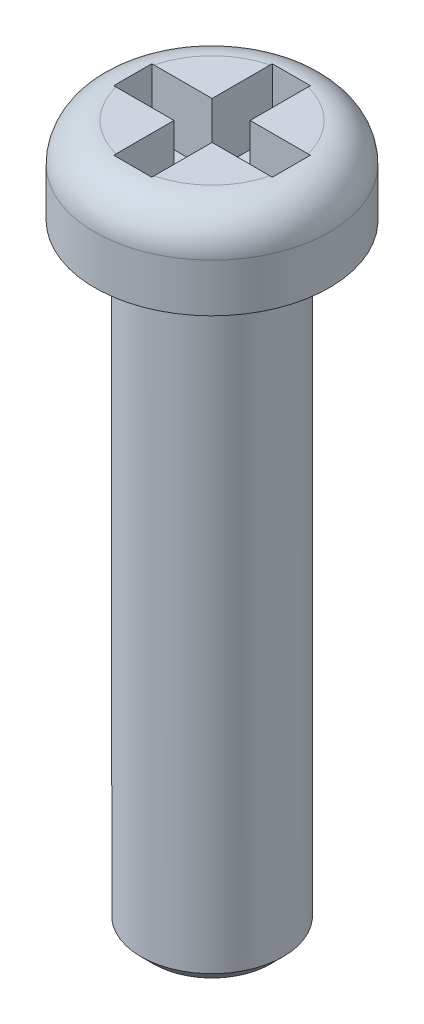
ISO-10303-21;
HEADER;
FILE_DESCRIPTION(('STEP AP214'),'2;1');
FILE_NAME('part.step','',(''),(''),'','','');
FILE_SCHEMA(('AUTOMOTIVE_DESIGN { 1 0 10303 214 1 1 1 1 }'));
ENDSEC;
DATA;
#1=APPLICATION_CONTEXT('core data for automotive mechanical design processes');
#2=APPLICATION_PROTOCOL_DEFINITION('international standard','automotive_design',2000,#1);
#3=PRODUCT_CONTEXT('',#1,'mechanical');
#4=PRODUCT('Part','Part','',(#3));
#5=PRODUCT_RELATED_PRODUCT_CATEGORY('part','',(#4));
#6=PRODUCT_DEFINITION_FORMATION('','',#4);
#7=PRODUCT_DEFINITION_CONTEXT('part definition',#1,'design');
#8=PRODUCT_DEFINITION('design','',#6,#7);
#9=PRODUCT_DEFINITION_SHAPE('','',#8);
#10=(LENGTH_UNIT() NAMED_UNIT(*) SI_UNIT(.MILLI.,.METRE.));
#11=(NAMED_UNIT(*) PLANE_ANGLE_UNIT() SI_UNIT($,.RADIAN.));
#12=(NAMED_UNIT(*) SI_UNIT($,.STERADIAN.) SOLID_ANGLE_UNIT());
#13=UNCERTAINTY_MEASURE_WITH_UNIT(LENGTH_MEASURE(1.E-05),#10,'distance_accuracy_value','');
#14=(GEOMETRIC_REPRESENTATION_CONTEXT(3) GLOBAL_UNCERTAINTY_ASSIGNED_CONTEXT((#13)) GLOBAL_UNIT_ASSIGNED_CONTEXT((#10,
#11,#12)) REPRESENTATION_CONTEXT('',''));
#15=CARTESIAN_POINT('',(0.,0.,0.));
#16=DIRECTION('',(0.,0.,1.));
#17=DIRECTION('',(1.,0.,0.));
#18=AXIS2_PLACEMENT_3D('',#15,#16,#17);
#19=CARTESIAN_POINT('',(-0.380999999999951,0.457199999999935,0.381000000000062));
#20=DIRECTION('',(0.,-1.,0.));
#21=DIRECTION('',(0.,0.,-1.));
#22=AXIS2_PLACEMENT_3D('',#19,#20,#21);
#23=PLANE('',#22);
#24=DIRECTION('',(1.,0.,0.));
#25=VECTOR('',#24,1.);
#26=CARTESIAN_POINT('',(-0.381000000000006,0.457199999999956,1.58750000000001));
#27=LINE('',#26,#25);
#28=CARTESIAN_POINT('',(-0.381000000000006,0.457199999999942,1.58750000000001));
#29=VERTEX_POINT('',#28);
#30=CARTESIAN_POINT('',(0.381000000000131,0.457199999999956,1.58750000000001));
#31=VERTEX_POINT('',#30);
#32=EDGE_CURVE('E320',#29,#31,#27,.T.);
#33=ORIENTED_EDGE('',*,*,#32,.T.);
#34=DIRECTION('',(0.,0.,1.));
#35=VECTOR('',#34,1.);
#36=CARTESIAN_POINT('',(0.381000000000131,0.457199999999956,1.58750000000004));
#37=LINE('',#36,#35);
#38=CARTESIAN_POINT('',(0.381000000000131,0.457199999999949,0.381000000000006));
#39=VERTEX_POINT('',#38);
#40=EDGE_CURVE('E448',#31,#39,#37,.F.);
#41=ORIENTED_EDGE('',*,*,#40,.T.);
#42=DIRECTION('',(1.,0.,0.));
#43=VECTOR('',#42,1.);
#44=CARTESIAN_POINT('',(0.380999999999992,0.457199999999935,0.381000000000006));
#45=LINE('',#44,#43);
#46=CARTESIAN_POINT('',(1.58750000000005,0.457199999999935,0.381000000000006));
#47=VERTEX_POINT('',#46);
#48=EDGE_CURVE('E455',#39,#47,#45,.T.);
#49=ORIENTED_EDGE('',*,*,#48,.T.);
#50=DIRECTION('',(0.,0.,1.));
#51=VECTOR('',#50,1.);
#52=CARTESIAN_POINT('',(1.58750000000005,0.457199999999935,0.381000000000055));
#53=LINE('',#52,#51);
#54=CARTESIAN_POINT('',(1.58750000000005,0.457199999999935,-0.380999999999976));
#55=VERTEX_POINT('',#54);
#56=EDGE_CURVE('E150',#47,#55,#53,.F.);
#57=ORIENTED_EDGE('',*,*,#56,.T.);
#58=DIRECTION('',(1.,0.,0.));
#59=VECTOR('',#58,1.);
#60=CARTESIAN_POINT('',(0.381000000000131,0.457199999999935,-0.381000000000027));
#61=LINE('',#60,#59);
#62=CARTESIAN_POINT('',(0.381000000000131,0.457199999999935,-0.381000000000026));
#63=VERTEX_POINT('',#62);
#64=EDGE_CURVE('E146',#55,#63,#61,.F.);
#65=ORIENTED_EDGE('',*,*,#64,.T.);
#66=DIRECTION('',(0.,0.,1.));
#67=VECTOR('',#66,1.);
#68=CARTESIAN_POINT('',(0.381000000000131,0.457199999999935,-0.381000000000027));
#69=LINE('',#68,#67);
#70=CARTESIAN_POINT('',(0.381000000000029,0.457199999999949,-1.58749999999998));
#71=VERTEX_POINT('',#70);
#72=EDGE_CURVE('E147',#63,#71,#69,.F.);
#73=ORIENTED_EDGE('',*,*,#72,.T.);
#74=DIRECTION('',(1.,0.,0.));
#75=VECTOR('',#74,1.);
#76=CARTESIAN_POINT('',(-0.380999999999951,0.457199999999956,-1.58749999999997));
#77=LINE('',#76,#75);
#78=CARTESIAN_POINT('',(-0.380999999999955,0.457199999999956,-1.58749999999997));
#79=VERTEX_POINT('',#78);
#80=EDGE_CURVE('E88',#71,#79,#77,.F.);
#81=ORIENTED_EDGE('',*,*,#80,.T.);
#82=DIRECTION('',(0.,0.,1.));
#83=VECTOR('',#82,1.);
#84=CARTESIAN_POINT('',(-0.380999999999965,0.457199999999956,-0.380999999999951));
#85=LINE('',#84,#83);
#86=CARTESIAN_POINT('',(-0.380999999999965,0.457199999999949,-0.380999999999965));
#87=VERTEX_POINT('',#86);
#88=EDGE_CURVE('E412',#79,#87,#85,.T.);
#89=ORIENTED_EDGE('',*,*,#88,.T.);
#90=DIRECTION('',(1.,0.,0.));
#91=VECTOR('',#90,1.);
#92=CARTESIAN_POINT('',(-1.58750000000001,0.457199999999935,-0.380999999999992));
#93=LINE('',#92,#91);
#94=CARTESIAN_POINT('',(-1.58749999999999,0.457199999999935,-0.380999999999992));
#95=VERTEX_POINT('',#94);
#96=EDGE_CURVE('E424',#87,#95,#93,.F.);
#97=ORIENTED_EDGE('',*,*,#96,.T.);
#98=DIRECTION('',(0.,0.,1.));
#99=VECTOR('',#98,1.);
#100=CARTESIAN_POINT('',(-1.58749999999995,0.457199999999935,0.381000000000058));
#101=LINE('',#100,#99);
#102=CARTESIAN_POINT('',(-1.58749999999995,0.457199999999935,0.381000000000058));
#103=VERTEX_POINT('',#102);
#104=EDGE_CURVE('E430',#95,#103,#101,.T.);
#105=ORIENTED_EDGE('',*,*,#104,.T.);
#106=DIRECTION('',(1.,0.,0.));
#107=VECTOR('',#106,1.);
#108=CARTESIAN_POINT('',(-1.58749999999995,0.457199999999935,0.381000000000058));
#109=LINE('',#108,#107);
#110=CARTESIAN_POINT('',(-0.380999999999969,0.457199999999935,0.381000000000058));
#111=VERTEX_POINT('',#110);
#112=EDGE_CURVE('E300',#103,#111,#109,.T.);
#113=ORIENTED_EDGE('',*,*,#112,.T.);
#114=DIRECTION('',(0.,0.,1.));
#115=VECTOR('',#114,1.);
#116=CARTESIAN_POINT('',(-0.381000000000006,0.457199999999935,1.58750000000001));
#117=LINE('',#116,#115);
#118=EDGE_CURVE('E315',#111,#29,#117,.T.);
#119=ORIENTED_EDGE('',*,*,#118,.T.);
#120=EDGE_LOOP('',(#33,#41,#49,#57,#65,#73,#81,#89,#97,#105,#113,#119));
#121=FACE_BOUND('',#120,.T.);
#122=ADVANCED_FACE('F16',(#121),#23,.F.);
#123=CARTESIAN_POINT('',(0.381000000000131,0.457199999999935,-0.381000000000027));
#124=DIRECTION('',(1.,0.,0.));
#125=DIRECTION('',(0.,1.,0.));
#126=AXIS2_PLACEMENT_3D('',#123,#124,#125);
#127=PLANE('',#126);
#128=DIRECTION('',(0.,1.,0.));
#129=VECTOR('',#128,1.);
#130=CARTESIAN_POINT('',(0.380999999999979,0.457199999999956,-1.58749999999997));
#131=LINE('',#130,#129);
#132=CARTESIAN_POINT('',(0.381000000000054,1.72586536617557,-1.58749999999998));
#133=VERTEX_POINT('',#132);
#134=EDGE_CURVE('E157',#133,#71,#131,.F.);
#135=ORIENTED_EDGE('',*,*,#134,.T.);
#136=ORIENTED_EDGE('',*,*,#72,.F.);
#137=DIRECTION('',(0.,1.,0.));
#138=VECTOR('',#137,1.);
#139=CARTESIAN_POINT('',(0.381000000000131,0.457199999999935,-0.381000000000027));
#140=LINE('',#139,#138);
#141=CARTESIAN_POINT('',(0.381000000000103,1.72719999999994,-0.381000000000022));
#142=VERTEX_POINT('',#141);
#143=EDGE_CURVE('E142',#63,#142,#140,.T.);
#144=ORIENTED_EDGE('',*,*,#143,.T.);
#145=DIRECTION('',(0.,0.,1.));
#146=VECTOR('',#145,1.);
#147=CARTESIAN_POINT('',(0.381000000000048,1.72719999999994,0.));
#148=LINE('',#147,#146);
#149=CARTESIAN_POINT('',(0.381000000000064,1.72719999999994,-1.54110195963796));
#150=VERTEX_POINT('',#149);
#151=EDGE_CURVE('E153',#150,#142,#148,.T.);
#152=ORIENTED_EDGE('',*,*,#151,.F.);
#153=CARTESIAN_POINT('',(0.38100000000013,1.72586536617566,-1.5875));
#154=CARTESIAN_POINT('',(0.38100000000013,1.72631039087676,-1.57977339592367));
#155=CARTESIAN_POINT('',(0.38100000000013,1.72664412271266,-1.572043590522));
#156=CARTESIAN_POINT('',(0.38100000000013,1.72708900065408,-1.55657757706799));
#157=CARTESIAN_POINT('',(0.38100000000013,1.7272001467596,-1.54884136901564));
#158=CARTESIAN_POINT('',(0.38100000000013,1.72719999999993,-1.54110195963796));
#159=B_SPLINE_CURVE_WITH_KNOTS('',3,(#153,#154,#155,#156,#157,#158),.UNSPECIFIED.,.F.,.F.,(4,2,
4),(0.,0.0232110192876882,0.0464220385753764),.UNSPECIFIED.);
#160=EDGE_CURVE('E207',#133,#150,#159,.T.);
#161=ORIENTED_EDGE('',*,*,#160,.F.);
#162=EDGE_LOOP('',(#135,#136,#144,#152,#161));
#163=FACE_BOUND('',#162,.T.);
#164=ADVANCED_FACE('F155',(#163),#127,.F.);
#165=CARTESIAN_POINT('',(0.,1.72719999999994,0.));
#166=DIRECTION('',(0.,1.,0.));
#167=DIRECTION('',(0.,0.,1.));
#168=AXIS2_PLACEMENT_3D('',#165,#166,#167);
#169=PLANE('',#168);
#170=DIRECTION('',(1.,0.,0.));
#171=VECTOR('',#170,1.);
#172=CARTESIAN_POINT('',(0.381000000000131,1.72719999999994,-0.381000000000022));
#173=LINE('',#172,#171);
#174=CARTESIAN_POINT('',(1.54110195963804,1.72719999999993,-0.380999999999991));
#175=VERTEX_POINT('',#174);
#176=EDGE_CURVE('E162',#142,#175,#173,.T.);
#177=ORIENTED_EDGE('',*,*,#176,.T.);
#178=CARTESIAN_POINT('',(0.,1.72719999999994,0.));
#179=DIRECTION('',(0.,-1.,0.));
#180=DIRECTION('',(0.24000000000003,0.,-0.97077288796092));
#181=AXIS2_PLACEMENT_3D('',#178,#179,#180);
#182=CIRCLE('',#181,1.5875);
#183=EDGE_CURVE('E375',#150,#175,#182,.T.);
#184=ORIENTED_EDGE('',*,*,#183,.F.);
#185=ORIENTED_EDGE('',*,*,#151,.T.);
#186=EDGE_LOOP('',(#177,#184,#185));
#187=FACE_BOUND('',#186,.T.);
#188=ADVANCED_FACE('F385',(#187),#169,.T.);
#189=CARTESIAN_POINT('',(0.381000000000131,0.457199999999935,-0.381000000000027));
#190=DIRECTION('',(0.,0.,-1.));
#191=DIRECTION('',(0.,1.,0.));
#192=AXIS2_PLACEMENT_3D('',#189,#190,#191);
#193=PLANE('',#192);
#194=ORIENTED_EDGE('',*,*,#176,.F.);
#195=ORIENTED_EDGE('',*,*,#143,.F.);
#196=ORIENTED_EDGE('',*,*,#64,.F.);
#197=DIRECTION('',(0.,1.,0.));
#198=VECTOR('',#197,1.);
#199=CARTESIAN_POINT('',(1.58750000000005,0.457199999999935,-0.380999999999951));
#200=LINE('',#199,#198);
#201=CARTESIAN_POINT('',(1.58750000000005,1.72586536617567,-0.380999999999961));
#202=VERTEX_POINT('',#201);
#203=EDGE_CURVE('E458',#55,#202,#200,.T.);
#204=ORIENTED_EDGE('',*,*,#203,.T.);
#205=CARTESIAN_POINT('',(1.54110195963804,1.72719999999993,-0.381000000000021));
#206=CARTESIAN_POINT('',(1.54884136901573,1.72720014675961,-0.381000000000022));
#207=CARTESIAN_POINT('',(1.55657757706807,1.72708900065409,-0.381000000000022));
#208=CARTESIAN_POINT('',(1.57204359052207,1.72664412271266,-0.381000000000022));
#209=CARTESIAN_POINT('',(1.57977339592374,1.72631039087676,-0.381000000000021));
#210=CARTESIAN_POINT('',(1.58750000000006,1.72586536617566,-0.381000000000021));
#211=B_SPLINE_CURVE_WITH_KNOTS('',3,(#205,#206,#207,#208,#209,#210),.UNSPECIFIED.,.F.,.F.,(4,2,
4),(0.,0.0232110192876795,0.0464220385753591),.UNSPECIFIED.);
#212=EDGE_CURVE('E372',#175,#202,#211,.T.);
#213=ORIENTED_EDGE('',*,*,#212,.F.);
#214=EDGE_LOOP('',(#194,#195,#196,#204,#213));
#215=FACE_BOUND('',#214,.T.);
#216=ADVANCED_FACE('F160',(#215),#193,.F.);
#217=CARTESIAN_POINT('',(1.58750000000005,0.457199999999935,0.381000000000055));
#218=DIRECTION('',(1.,0.,0.));
#219=DIRECTION('',(0.,1.,0.));
#220=AXIS2_PLACEMENT_3D('',#217,#218,#219);
#221=PLANE('',#220);
#222=ORIENTED_EDGE('',*,*,#203,.F.);
#223=ORIENTED_EDGE('',*,*,#56,.F.);
#224=DIRECTION('',(0.,-1.,0.));
#225=VECTOR('',#224,1.);
#226=CARTESIAN_POINT('',(1.58750000000005,0.457199999999935,0.381000000000006));
#227=LINE('',#226,#225);
#228=CARTESIAN_POINT('',(1.58750000000003,1.72586536617602,0.381000000000012));
#229=VERTEX_POINT('',#228);
#230=EDGE_CURVE('E457',#47,#229,#227,.F.);
#231=ORIENTED_EDGE('',*,*,#230,.T.);
#232=CARTESIAN_POINT('',(1.58750000000005,1.72586536617567,-0.380999999999968));
#233=CARTESIAN_POINT('',(1.58750000000005,1.72630032840319,-0.349251527473842));
#234=CARTESIAN_POINT('',(1.58750000000005,1.72658366334504,-0.317501816768122));
#235=CARTESIAN_POINT('',(1.58750000000005,1.72696189328675,-0.254001693506406));
#236=CARTESIAN_POINT('',(1.58750000000005,1.72705679145661,-0.222251280971203));
#237=CARTESIAN_POINT('',(1.58750000000005,1.72723105739994,-0.127000574578058));
#238=CARTESIAN_POINT('',(1.58750000000005,1.72719999999993,-0.0635002872890134));
#239=CARTESIAN_POINT('',(1.58750000000005,1.72719999999994,0.0635002872890758));
#240=CARTESIAN_POINT('',(1.58750000000005,1.72723105739994,0.12700057457812));
#241=CARTESIAN_POINT('',(1.58750000000005,1.72705679145661,0.222251280971266));
#242=CARTESIAN_POINT('',(1.58750000000005,1.72696189328675,0.254001693506469));
#243=CARTESIAN_POINT('',(1.58750000000005,1.72658366334504,0.317501816768184));
#244=CARTESIAN_POINT('',(1.58750000000005,1.72630032840319,0.349251527473904));
#245=CARTESIAN_POINT('',(1.58750000000005,1.72586536617567,0.38100000000003));
#246=B_SPLINE_CURVE_WITH_KNOTS('',3,(#232,#233,#234,#235,#236,#237,#238,#239,#240,#241,#242,
#243,#244,#245),.UNSPECIFIED.,.F.,.F.,(4,2,2,2,2,2,4),(0.,0.095252834204753,0.190504065991027,
0.381004955633297,0.571505845275568,0.666757077061841,0.762009911266594),.UNSPECIFIED.);
#247=EDGE_CURVE('E366',#202,#229,#246,.T.);
#248=ORIENTED_EDGE('',*,*,#247,.F.);
#249=EDGE_LOOP('',(#222,#223,#231,#248));
#250=FACE_BOUND('',#249,.T.);
#251=ADVANCED_FACE('F353',(#250),#221,.F.);
#252=CARTESIAN_POINT('',(0.380999999999992,0.457199999999935,0.381000000000006));
#253=DIRECTION('',(0.,0.,1.));
#254=DIRECTION('',(0.,-1.,0.));
#255=AXIS2_PLACEMENT_3D('',#252,#253,#254);
#256=PLANE('',#255);
#257=ORIENTED_EDGE('',*,*,#230,.F.);
#258=ORIENTED_EDGE('',*,*,#48,.F.);
#259=DIRECTION('',(0.,1.,0.));
#260=VECTOR('',#259,1.);
#261=CARTESIAN_POINT('',(0.381000000000131,0.457199999999956,0.381000000000006));
#262=LINE('',#261,#260);
#263=CARTESIAN_POINT('',(0.381000000000084,1.72719999999993,0.381000000000002));
#264=VERTEX_POINT('',#263);
#265=EDGE_CURVE('E321',#39,#264,#262,.T.);
#266=ORIENTED_EDGE('',*,*,#265,.T.);
#267=DIRECTION('',(1.,0.,0.));
#268=VECTOR('',#267,1.);
#269=CARTESIAN_POINT('',(0.,1.72719999999993,0.380999999999992));
#270=LINE('',#269,#268);
#271=CARTESIAN_POINT('',(1.54110195963815,1.72719999999994,0.380999999999996));
#272=VERTEX_POINT('',#271);
#273=EDGE_CURVE('E335',#272,#264,#270,.F.);
#274=ORIENTED_EDGE('',*,*,#273,.F.);
#275=CARTESIAN_POINT('',(1.58750000000001,1.72586536617567,0.381000000000011));
#276=CARTESIAN_POINT('',(1.57977339592371,1.72631039087676,0.381000000000012));
#277=CARTESIAN_POINT('',(1.57204359052207,1.72664412271267,0.381000000000012));
#278=CARTESIAN_POINT('',(1.55657757706812,1.72708900065409,0.381000000000012));
#279=CARTESIAN_POINT('',(1.5488413690158,1.72720014675961,0.381000000000012));
#280=CARTESIAN_POINT('',(1.54110195963815,1.72719999999994,0.381000000000012));
#281=B_SPLINE_CURVE_WITH_KNOTS('',3,(#275,#276,#277,#278,#279,#280),.UNSPECIFIED.,.F.,.F.,(4,2,
4),(0.,0.023211019287599,0.0464220385751983),.UNSPECIFIED.);
#282=EDGE_CURVE('E364',#229,#272,#281,.T.);
#283=ORIENTED_EDGE('',*,*,#282,.F.);
#284=EDGE_LOOP('',(#257,#258,#266,#274,#283));
#285=FACE_BOUND('',#284,.T.);
#286=ADVANCED_FACE('F348',(#285),#256,.F.);
#287=CARTESIAN_POINT('',(0.,1.72719999999994,0.));
#288=DIRECTION('',(0.,1.,0.));
#289=DIRECTION('',(0.,0.,1.));
#290=AXIS2_PLACEMENT_3D('',#287,#288,#289);
#291=PLANE('',#290);
#292=DIRECTION('',(0.,0.,1.));
#293=VECTOR('',#292,1.);
#294=CARTESIAN_POINT('',(0.38100000000013,1.72719999999994,1.58750000000004));
#295=LINE('',#294,#293);
#296=CARTESIAN_POINT('',(0.381000000000101,1.72719999999994,1.5411019596382));
#297=VERTEX_POINT('',#296);
#298=EDGE_CURVE('E318',#264,#297,#295,.T.);
#299=ORIENTED_EDGE('',*,*,#298,.T.);
#300=CARTESIAN_POINT('',(0.,1.72719999999994,0.));
#301=DIRECTION('',(0.,-1.,0.));
#302=DIRECTION('',(0.970772887960935,0.,0.239999999999972));
#303=AXIS2_PLACEMENT_3D('',#300,#301,#302);
#304=CIRCLE('',#303,1.58750000000017);
#305=EDGE_CURVE('E329',#272,#297,#304,.T.);
#306=ORIENTED_EDGE('',*,*,#305,.F.);
#307=ORIENTED_EDGE('',*,*,#273,.T.);
#308=EDGE_LOOP('',(#299,#306,#307));
#309=FACE_BOUND('',#308,.T.);
#310=ADVANCED_FACE('F337',(#309),#291,.T.);
#311=CARTESIAN_POINT('',(0.381000000000131,0.457199999999956,1.58750000000004));
#312=DIRECTION('',(1.,0.,0.));
#313=DIRECTION('',(0.,1.,0.));
#314=AXIS2_PLACEMENT_3D('',#311,#312,#313);
#315=PLANE('',#314);
#316=ORIENTED_EDGE('',*,*,#298,.F.);
#317=ORIENTED_EDGE('',*,*,#265,.F.);
#318=ORIENTED_EDGE('',*,*,#40,.F.);
#319=DIRECTION('',(0.,-1.,0.));
#320=VECTOR('',#319,1.);
#321=CARTESIAN_POINT('',(0.381000000000131,0.457199999999956,1.58750000000001));
#322=LINE('',#321,#320);
#323=CARTESIAN_POINT('',(0.381000000000131,1.72586536617568,1.58750000000001));
#324=VERTEX_POINT('',#323);
#325=EDGE_CURVE('E408',#31,#324,#322,.F.);
#326=ORIENTED_EDGE('',*,*,#325,.T.);
#327=CARTESIAN_POINT('',(0.38100000000013,1.72719999999994,1.5411019596382));
#328=CARTESIAN_POINT('',(0.38100000000013,1.72720014675961,1.54884136901585));
#329=CARTESIAN_POINT('',(0.38100000000013,1.72708900065409,1.55657757706816));
#330=CARTESIAN_POINT('',(0.38100000000013,1.72664412271267,1.5720435905221));
#331=CARTESIAN_POINT('',(0.38100000000013,1.72631039087677,1.57977339592373));
#332=CARTESIAN_POINT('',(0.38100000000013,1.72586536617567,1.58750000000003));
#333=B_SPLINE_CURVE_WITH_KNOTS('',3,(#327,#328,#329,#330,#331,#332),.UNSPECIFIED.,.F.,.F.,(4,2,
4),(0.,0.0232110192875822,0.0464220385751646),.UNSPECIFIED.);
#334=EDGE_CURVE('E481',#297,#324,#333,.T.);
#335=ORIENTED_EDGE('',*,*,#334,.F.);
#336=EDGE_LOOP('',(#316,#317,#318,#326,#335));
#337=FACE_BOUND('',#336,.T.);
#338=ADVANCED_FACE('F347',(#337),#315,.F.);
#339=CARTESIAN_POINT('',(-0.381000000000006,0.457199999999956,1.58750000000001));
#340=DIRECTION('',(0.,0.,1.));
#341=DIRECTION('',(0.,-1.,0.));
#342=AXIS2_PLACEMENT_3D('',#339,#340,#341);
#343=PLANE('',#342);
#344=CARTESIAN_POINT('',(0.381000000000131,1.72586536617568,1.58750000000001));
#345=CARTESIAN_POINT('',(0.349251527473994,1.7263003284032,1.58750000000001));
#346=CARTESIAN_POINT('',(0.317501816768263,1.72658366334505,1.58750000000001));
#347=CARTESIAN_POINT('',(0.254001693506526,1.72696189328676,1.58750000000001));
#348=CARTESIAN_POINT('',(0.222251280971312,1.72705679145662,1.58750000000001));
#349=CARTESIAN_POINT('',(0.127000574578134,1.72723105739995,1.58750000000001));
#350=CARTESIAN_POINT('',(0.0635002872890674,1.72719999999994,1.58750000000001));
#351=CARTESIAN_POINT('',(-0.063500287289045,1.72719999999994,1.58750000000001));
#352=CARTESIAN_POINT('',(-0.127000574578091,1.72723105739995,1.58750000000001));
#353=CARTESIAN_POINT('',(-0.222251280971238,1.72705679145662,1.58750000000001));
#354=CARTESIAN_POINT('',(-0.254001693506442,1.72696189328676,1.58750000000001));
#355=CARTESIAN_POINT('',(-0.317501816768159,1.72658366334505,1.58750000000001));
#356=CARTESIAN_POINT('',(-0.349251527473879,1.7263003284032,1.58750000000001));
#357=CARTESIAN_POINT('',(-0.381000000000007,1.72586536617568,1.58750000000001));
#358=B_SPLINE_CURVE_WITH_KNOTS('',3,(#344,#345,#346,#347,#348,#349,#350,#351,#352,#353,#354,
#355,#356,#357),.UNSPECIFIED.,.F.,.F.,(4,2,2,2,2,2,4),(0.,0.0952528342047855,0.190504065991092,
0.381004955633428,0.571505845275702,0.666757077061978,0.762009911266733),.UNSPECIFIED.);
#359=CARTESIAN_POINT('',(-0.381000000000008,1.72586536617569,1.58750000000001));
#360=VERTEX_POINT('',#359);
#361=EDGE_CURVE('E79',#324,#360,#358,.T.);
#362=ORIENTED_EDGE('',*,*,#361,.F.);
#363=ORIENTED_EDGE('',*,*,#325,.F.);
#364=ORIENTED_EDGE('',*,*,#32,.F.);
#365=DIRECTION('',(0.,-1.,0.));
#366=VECTOR('',#365,1.);
#367=CARTESIAN_POINT('',(-0.381000000000006,0.457199999999956,1.58750000000001));
#368=LINE('',#367,#366);
#369=EDGE_CURVE('E301',#29,#360,#368,.F.);
#370=ORIENTED_EDGE('',*,*,#369,.T.);
#371=EDGE_LOOP('',(#362,#363,#364,#370));
#372=FACE_BOUND('',#371,.T.);
#373=ADVANCED_FACE('F500',(#372),#343,.F.);
#374=CARTESIAN_POINT('',(-0.381000000000006,0.457199999999956,1.58750000000001));
#375=DIRECTION('',(-1.,0.,0.));
#376=DIRECTION('',(0.,-1.,0.));
#377=AXIS2_PLACEMENT_3D('',#374,#375,#376);
#378=PLANE('',#377);
#379=ORIENTED_EDGE('',*,*,#369,.F.);
#380=ORIENTED_EDGE('',*,*,#118,.F.);
#381=DIRECTION('',(0.,-1.,0.));
#382=VECTOR('',#381,1.);
#383=CARTESIAN_POINT('',(-0.380999999999951,0.457199999999935,0.381000000000058));
#384=LINE('',#383,#382);
#385=CARTESIAN_POINT('',(-0.38099999999996,1.72719999999993,0.381000000000059));
#386=VERTEX_POINT('',#385);
#387=EDGE_CURVE('E436',#111,#386,#384,.F.);
#388=ORIENTED_EDGE('',*,*,#387,.T.);
#389=DIRECTION('',(0.,0.,1.));
#390=VECTOR('',#389,1.);
#391=CARTESIAN_POINT('',(-0.380999999999979,1.72719999999994,0.));
#392=LINE('',#391,#390);
#393=CARTESIAN_POINT('',(-0.380999999999984,1.72719999999994,1.54110195963802));
#394=VERTEX_POINT('',#393);
#395=EDGE_CURVE('E292',#394,#386,#392,.F.);
#396=ORIENTED_EDGE('',*,*,#395,.F.);
#397=CARTESIAN_POINT('',(-0.381000000000008,1.72586536617568,1.58750000000001));
#398=CARTESIAN_POINT('',(-0.381000000000008,1.72631039087677,1.57977339592369));
#399=CARTESIAN_POINT('',(-0.381000000000008,1.72664412271268,1.57204359052203));
#400=CARTESIAN_POINT('',(-0.381000000000008,1.7270890006541,1.55657757706804));
#401=CARTESIAN_POINT('',(-0.381000000000008,1.72720014675962,1.5488413690157));
#402=CARTESIAN_POINT('',(-0.381000000000008,1.72719999999994,1.54110195963803));
#403=B_SPLINE_CURVE_WITH_KNOTS('',3,(#397,#398,#399,#400,#401,#402),.UNSPECIFIED.,.F.,.F.,(4,2,
4),(0.,0.0232110192876606,0.0464220385753211),.UNSPECIFIED.);
#404=EDGE_CURVE('E270',#360,#394,#403,.T.);
#405=ORIENTED_EDGE('',*,*,#404,.F.);
#406=EDGE_LOOP('',(#379,#380,#388,#396,#405));
#407=FACE_BOUND('',#406,.T.);
#408=ADVANCED_FACE('F281',(#407),#378,.F.);
#409=CARTESIAN_POINT('',(0.,1.72719999999994,0.));
#410=DIRECTION('',(0.,1.,0.));
#411=DIRECTION('',(0.,0.,1.));
#412=AXIS2_PLACEMENT_3D('',#409,#410,#411);
#413=PLANE('',#412);
#414=DIRECTION('',(1.,0.,0.));
#415=VECTOR('',#414,1.);
#416=CARTESIAN_POINT('',(-1.58749999999995,1.72719999999994,0.381000000000064));
#417=LINE('',#416,#415);
#418=CARTESIAN_POINT('',(-1.54110195963794,1.72719999999994,0.381000000000054));
#419=VERTEX_POINT('',#418);
#420=EDGE_CURVE('E432',#386,#419,#417,.F.);
#421=ORIENTED_EDGE('',*,*,#420,.T.);
#422=CARTESIAN_POINT('',(0.,1.72719999999994,0.));
#423=DIRECTION('',(0.,-1.,0.));
#424=DIRECTION('',(-0.239999999999979,0.,0.970772887960933));
#425=AXIS2_PLACEMENT_3D('',#422,#423,#424);
#426=CIRCLE('',#425,1.58750000000005);
#427=EDGE_CURVE('E264',#394,#419,#426,.T.);
#428=ORIENTED_EDGE('',*,*,#427,.F.);
#429=ORIENTED_EDGE('',*,*,#395,.T.);
#430=EDGE_LOOP('',(#421,#428,#429));
#431=FACE_BOUND('',#430,.T.);
#432=ADVANCED_FACE('F276',(#431),#413,.T.);
#433=CARTESIAN_POINT('',(-1.58749999999995,0.457199999999935,0.381000000000058));
#434=DIRECTION('',(0.,0.,1.));
#435=DIRECTION('',(0.,-1.,0.));
#436=AXIS2_PLACEMENT_3D('',#433,#434,#435);
#437=PLANE('',#436);
#438=ORIENTED_EDGE('',*,*,#420,.F.);
#439=ORIENTED_EDGE('',*,*,#387,.F.);
#440=ORIENTED_EDGE('',*,*,#112,.F.);
#441=DIRECTION('',(0.,-1.,0.));
#442=VECTOR('',#441,1.);
#443=CARTESIAN_POINT('',(-1.58749999999995,0.457199999999935,0.381000000000058));
#444=LINE('',#443,#442);
#445=CARTESIAN_POINT('',(-1.58749999999995,1.72586536617567,0.381000000000059));
#446=VERTEX_POINT('',#445);
#447=EDGE_CURVE('E427',#103,#446,#444,.F.);
#448=ORIENTED_EDGE('',*,*,#447,.T.);
#449=CARTESIAN_POINT('',(-1.54110195963794,1.72719999999994,0.381000000000063));
#450=CARTESIAN_POINT('',(-1.54884136901562,1.72720014675961,0.381000000000064));
#451=CARTESIAN_POINT('',(-1.55657757706796,1.72708900065409,0.381000000000064));
#452=CARTESIAN_POINT('',(-1.57204359052196,1.72664412271267,0.381000000000064));
#453=CARTESIAN_POINT('',(-1.57977339592363,1.72631039087677,0.381000000000064));
#454=CARTESIAN_POINT('',(-1.58749999999995,1.72586536617568,0.381000000000063));
#455=B_SPLINE_CURVE_WITH_KNOTS('',3,(#449,#450,#451,#452,#453,#454),.UNSPECIFIED.,.F.,.F.,(4,2,
4),(0.,0.0232110192876747,0.0464220385753494),.UNSPECIFIED.);
#456=EDGE_CURVE('E261',#419,#446,#455,.T.);
#457=ORIENTED_EDGE('',*,*,#456,.F.);
#458=EDGE_LOOP('',(#438,#439,#440,#448,#457));
#459=FACE_BOUND('',#458,.T.);
#460=ADVANCED_FACE('F272',(#459),#437,.F.);
#461=CARTESIAN_POINT('',(-1.58749999999995,0.457199999999935,0.381000000000058));
#462=DIRECTION('',(-1.,0.,0.));
#463=DIRECTION('',(0.,-1.,0.));
#464=AXIS2_PLACEMENT_3D('',#461,#462,#463);
#465=PLANE('',#464);
#466=ORIENTED_EDGE('',*,*,#447,.F.);
#467=ORIENTED_EDGE('',*,*,#104,.F.);
#468=DIRECTION('',(0.,1.,0.));
#469=VECTOR('',#468,1.);
#470=CARTESIAN_POINT('',(-1.58750000000001,0.457199999999935,-0.380999999999992));
#471=LINE('',#470,#469);
#472=CARTESIAN_POINT('',(-1.58750000000001,1.72586536617556,-0.380999999999987));
#473=VERTEX_POINT('',#472);
#474=EDGE_CURVE('E426',#95,#473,#471,.T.);
#475=ORIENTED_EDGE('',*,*,#474,.T.);
#476=CARTESIAN_POINT('',(-1.58749999999995,1.72586536617568,0.381000000000061));
#477=CARTESIAN_POINT('',(-1.58749999999995,1.7263003284032,0.349251527473932));
#478=CARTESIAN_POINT('',(-1.58749999999995,1.72658366334505,0.31750181676821));
#479=CARTESIAN_POINT('',(-1.58749999999995,1.72696189328675,0.25400169350649));
#480=CARTESIAN_POINT('',(-1.58749999999995,1.72705679145662,0.222251280971285));
#481=CARTESIAN_POINT('',(-1.58749999999995,1.72723105739995,0.127000574578132));
#482=CARTESIAN_POINT('',(-1.58749999999995,1.72719999999994,0.0635002872890833));
#483=CARTESIAN_POINT('',(-1.58749999999995,1.72719999999994,-0.0635002872890149));
#484=CARTESIAN_POINT('',(-1.58749999999995,1.72723105739995,-0.127000574578064));
#485=CARTESIAN_POINT('',(-1.58749999999995,1.72705679145662,-0.222251280971216));
#486=CARTESIAN_POINT('',(-1.58749999999995,1.72696189328675,-0.254001693506422));
#487=CARTESIAN_POINT('',(-1.58749999999995,1.72658366334504,-0.317501816768141));
#488=CARTESIAN_POINT('',(-1.58749999999995,1.72630032840319,-0.349251527473863));
#489=CARTESIAN_POINT('',(-1.58749999999995,1.72586536617568,-0.380999999999992));
#490=B_SPLINE_CURVE_WITH_KNOTS('',3,(#476,#477,#478,#479,#480,#481,#482,#483,#484,#485,#486,
#487,#488,#489),.UNSPECIFIED.,.F.,.F.,(4,2,2,2,2,2,4),(0.,0.0952528342047597,0.19050406599104,
0.381004955633324,0.571505845275608,0.666757077061889,0.762009911266649),.UNSPECIFIED.);
#491=EDGE_CURVE('E255',#446,#473,#490,.T.);
#492=ORIENTED_EDGE('',*,*,#491,.F.);
#493=EDGE_LOOP('',(#466,#467,#475,#492));
#494=FACE_BOUND('',#493,.T.);
#495=ADVANCED_FACE('F243',(#494),#465,.F.);
#496=CARTESIAN_POINT('',(-1.58750000000001,0.457199999999935,-0.380999999999992));
#497=DIRECTION('',(0.,0.,-1.));
#498=DIRECTION('',(0.,1.,0.));
#499=AXIS2_PLACEMENT_3D('',#496,#497,#498);
#500=PLANE('',#499);
#501=ORIENTED_EDGE('',*,*,#474,.F.);
#502=ORIENTED_EDGE('',*,*,#96,.F.);
#503=DIRECTION('',(0.,-1.,0.));
#504=VECTOR('',#503,1.);
#505=CARTESIAN_POINT('',(-0.380999999999965,0.457199999999935,-0.380999999999951));
#506=LINE('',#505,#504);
#507=CARTESIAN_POINT('',(-0.380999999999966,1.72719999999994,-0.380999999999955));
#508=VERTEX_POINT('',#507);
#509=EDGE_CURVE('E212',#87,#508,#506,.F.);
#510=ORIENTED_EDGE('',*,*,#509,.T.);
#511=DIRECTION('',(1.,0.,0.));
#512=VECTOR('',#511,1.);
#513=CARTESIAN_POINT('',(0.,1.72719999999994,-0.380999999999965));
#514=LINE('',#513,#512);
#515=CARTESIAN_POINT('',(-1.54110195963793,1.72719999999994,-0.380999999999969));
#516=VERTEX_POINT('',#515);
#517=EDGE_CURVE('E226',#516,#508,#514,.T.);
#518=ORIENTED_EDGE('',*,*,#517,.F.);
#519=CARTESIAN_POINT('',(-1.58750000000001,1.72586536617567,-0.380999999999988));
#520=CARTESIAN_POINT('',(-1.57977339592367,1.72631039087677,-0.380999999999988));
#521=CARTESIAN_POINT('',(-1.572043590522,1.72664412271267,-0.380999999999987));
#522=CARTESIAN_POINT('',(-1.55657757706797,1.72708900065409,-0.380999999999987));
#523=CARTESIAN_POINT('',(-1.54884136901562,1.72720014675961,-0.380999999999986));
#524=CARTESIAN_POINT('',(-1.54110195963793,1.72719999999994,-0.380999999999986));
#525=B_SPLINE_CURVE_WITH_KNOTS('',3,(#519,#520,#521,#522,#523,#524),.UNSPECIFIED.,.F.,.F.,(4,2,
4),(0.,0.0232110192877101,0.0464220385754204),.UNSPECIFIED.);
#526=EDGE_CURVE('E254',#473,#516,#525,.T.);
#527=ORIENTED_EDGE('',*,*,#526,.F.);
#528=EDGE_LOOP('',(#501,#502,#510,#518,#527));
#529=FACE_BOUND('',#528,.T.);
#530=ADVANCED_FACE('F238',(#529),#500,.F.);
#531=CARTESIAN_POINT('',(0.,1.72719999999994,0.));
#532=DIRECTION('',(0.,1.,0.));
#533=DIRECTION('',(0.,0.,1.));
#534=AXIS2_PLACEMENT_3D('',#531,#532,#533);
#535=PLANE('',#534);
#536=DIRECTION('',(0.,0.,1.));
#537=VECTOR('',#536,1.);
#538=CARTESIAN_POINT('',(-0.380999999999966,1.72719999999994,-0.380999999999951));
#539=LINE('',#538,#537);
#540=CARTESIAN_POINT('',(-0.38099999999998,1.72719999999993,-1.54110195963815));
#541=VERTEX_POINT('',#540);
#542=EDGE_CURVE('E210',#508,#541,#539,.F.);
#543=ORIENTED_EDGE('',*,*,#542,.T.);
#544=CARTESIAN_POINT('',(0.,1.72719999999994,0.));
#545=DIRECTION('',(0.,-1.,0.));
#546=DIRECTION('',(-0.970772887960932,0.,-0.239999999999983));
#547=AXIS2_PLACEMENT_3D('',#544,#545,#546);
#548=CIRCLE('',#547,1.58749999999995);
#549=EDGE_CURVE('E220',#516,#541,#548,.T.);
#550=ORIENTED_EDGE('',*,*,#549,.F.);
#551=ORIENTED_EDGE('',*,*,#517,.T.);
#552=EDGE_LOOP('',(#543,#550,#551));
#553=FACE_BOUND('',#552,.T.);
#554=ADVANCED_FACE('F228',(#553),#535,.T.);
#555=CARTESIAN_POINT('',(-0.380999999999965,0.457199999999935,-0.380999999999951));
#556=DIRECTION('',(-1.,0.,0.));
#557=DIRECTION('',(0.,-1.,0.));
#558=AXIS2_PLACEMENT_3D('',#555,#556,#557);
#559=PLANE('',#558);
#560=ORIENTED_EDGE('',*,*,#542,.F.);
#561=ORIENTED_EDGE('',*,*,#509,.F.);
#562=ORIENTED_EDGE('',*,*,#88,.F.);
#563=DIRECTION('',(0.,1.,0.));
#564=VECTOR('',#563,1.);
#565=CARTESIAN_POINT('',(-0.380999999999951,0.457199999999956,-1.58749999999997));
#566=LINE('',#565,#564);
#567=CARTESIAN_POINT('',(-0.380999999999952,1.72586536617568,-1.58749999999996));
#568=VERTEX_POINT('',#567);
#569=EDGE_CURVE('E36',#79,#568,#566,.T.);
#570=ORIENTED_EDGE('',*,*,#569,.T.);
#571=CARTESIAN_POINT('',(-0.380999999999966,1.72719999999993,-1.54110195963815));
#572=CARTESIAN_POINT('',(-0.380999999999966,1.7272001467596,-1.54884136901579));
#573=CARTESIAN_POINT('',(-0.380999999999966,1.72708900065408,-1.5565775770681));
#574=CARTESIAN_POINT('',(-0.380999999999966,1.72664412271266,-1.57204359052204));
#575=CARTESIAN_POINT('',(-0.380999999999966,1.72631039087676,-1.57977339592367));
#576=CARTESIAN_POINT('',(-0.380999999999967,1.72586536617567,-1.58749999999996));
#577=B_SPLINE_CURVE_WITH_KNOTS('',3,(#571,#572,#573,#574,#575,#576),.UNSPECIFIED.,.F.,.F.,(4,2,
4),(0.,0.0232110192875785,0.0464220385751568),.UNSPECIFIED.);
#578=EDGE_CURVE('E184',#541,#568,#577,.T.);
#579=ORIENTED_EDGE('',*,*,#578,.F.);
#580=EDGE_LOOP('',(#560,#561,#562,#570,#579));
#581=FACE_BOUND('',#580,.T.);
#582=ADVANCED_FACE('F237',(#581),#559,.F.);
#583=CARTESIAN_POINT('',(-0.380999999999951,0.457199999999956,-1.58749999999997));
#584=DIRECTION('',(0.,0.,-1.));
#585=DIRECTION('',(0.,1.,0.));
#586=AXIS2_PLACEMENT_3D('',#583,#584,#585);
#587=PLANE('',#586);
#588=CARTESIAN_POINT('',(-0.380999999999954,1.72586536617567,-1.58749999999996));
#589=CARTESIAN_POINT('',(-0.349251527473831,1.72630032840319,-1.58749999999996));
#590=CARTESIAN_POINT('',(-0.317501816768115,1.72658366334504,-1.58749999999996));
#591=CARTESIAN_POINT('',(-0.254001693506407,1.72696189328675,-1.58749999999996));
#592=CARTESIAN_POINT('',(-0.222251280971208,1.72705679145661,-1.58749999999996));
#593=CARTESIAN_POINT('',(-0.127000574578073,1.72723105739994,-1.58749999999996));
#594=CARTESIAN_POINT('',(-0.0635002872890363,1.72719999999993,-1.58749999999996));
#595=CARTESIAN_POINT('',(0.0635002872890473,1.72719999999993,-1.58749999999996));
#596=CARTESIAN_POINT('',(0.127000574578094,1.72723105739994,-1.58749999999996));
#597=CARTESIAN_POINT('',(0.222251280971242,1.72705679145661,-1.58749999999996));
#598=CARTESIAN_POINT('',(0.254001693506446,1.72696189328674,-1.58749999999996));
#599=CARTESIAN_POINT('',(0.317501816768163,1.72658366334504,-1.58749999999996));
#600=CARTESIAN_POINT('',(0.349251527473884,1.72630032840319,-1.58749999999996));
#601=CARTESIAN_POINT('',(0.381000000000011,1.72586536617567,-1.58749999999996));
#602=B_SPLINE_CURVE_WITH_KNOTS('',3,(#588,#589,#590,#591,#592,#593,#594,#595,#596,#597,#598,
#599,#600,#601),.UNSPECIFIED.,.F.,.F.,(4,2,2,2,2,2,4),(0.,0.0952528342047418,0.190504065991005,
0.381004955633253,0.571505845275529,0.666757077061805,0.762009911266561),.UNSPECIFIED.);
#603=EDGE_CURVE('E70',#568,#133,#602,.T.);
#604=ORIENTED_EDGE('',*,*,#603,.F.);
#605=ORIENTED_EDGE('',*,*,#569,.F.);
#606=ORIENTED_EDGE('',*,*,#80,.F.);
#607=ORIENTED_EDGE('',*,*,#134,.F.);
#608=EDGE_LOOP('',(#604,#605,#606,#607));
#609=FACE_BOUND('',#608,.T.);
#610=ADVANCED_FACE('F186',(#609),#587,.F.);
#611=CARTESIAN_POINT('',(0.,0.965199999999937,0.));
#612=DIRECTION('',(0.,-1.,0.));
#613=DIRECTION('',(0.,0.,-1.));
#614=AXIS2_PLACEMENT_3D('',#611,#612,#613);
#615=TOROIDAL_SURFACE('',#614,1.5875,0.762);
#616=ORIENTED_EDGE('',*,*,#334,.T.);
#617=ORIENTED_EDGE('',*,*,#361,.T.);
#618=ORIENTED_EDGE('',*,*,#404,.T.);
#619=ORIENTED_EDGE('',*,*,#427,.T.);
#620=ORIENTED_EDGE('',*,*,#456,.T.);
#621=ORIENTED_EDGE('',*,*,#491,.T.);
#622=ORIENTED_EDGE('',*,*,#526,.T.);
#623=ORIENTED_EDGE('',*,*,#549,.T.);
#624=ORIENTED_EDGE('',*,*,#578,.T.);
#625=ORIENTED_EDGE('',*,*,#603,.T.);
#626=ORIENTED_EDGE('',*,*,#160,.T.);
#627=ORIENTED_EDGE('',*,*,#183,.T.);
#628=ORIENTED_EDGE('',*,*,#212,.T.);
#629=ORIENTED_EDGE('',*,*,#247,.T.);
#630=ORIENTED_EDGE('',*,*,#282,.T.);
#631=ORIENTED_EDGE('',*,*,#305,.T.);
#632=EDGE_LOOP('',(#616,#617,#618,#619,#620,#621,#622,#623,#624,#625,#626,#627,#628,#629,#630,#631));
#633=FACE_BOUND('',#632,.T.);
#634=CARTESIAN_POINT('',(0.,0.965199999999927,0.));
#635=DIRECTION('',(0.,-1.,0.));
#636=DIRECTION('',(0.,0.,-1.));
#637=AXIS2_PLACEMENT_3D('',#634,#635,#636);
#638=CIRCLE('',#637,2.34950000000003);
#639=CARTESIAN_POINT('',(0.,0.965199999999917,-2.34950000000003));
#640=VERTEX_POINT('',#639);
#641=EDGE_CURVE('E178',#640,#640,#638,.T.);
#642=ORIENTED_EDGE('',*,*,#641,.F.);
#643=EDGE_LOOP('',(#642));
#644=FACE_BOUND('',#643,.T.);
#645=ADVANCED_FACE('F190',(#633,#644),#615,.T.);
#646=CARTESIAN_POINT('',(0.,0.,0.));
#647=DIRECTION('',(0.,-1.,0.));
#648=DIRECTION('',(0.,0.,-1.));
#649=AXIS2_PLACEMENT_3D('',#646,#647,#648);
#650=CYLINDRICAL_SURFACE('',#649,2.34950000000003);
#651=ORIENTED_EDGE('',*,*,#641,.T.);
#652=EDGE_LOOP('',(#651));
#653=FACE_BOUND('',#652,.T.);
#654=CARTESIAN_POINT('',(0.,0.,0.));
#655=DIRECTION('',(0.,-1.,0.));
#656=DIRECTION('',(0.,0.,-1.));
#657=AXIS2_PLACEMENT_3D('',#654,#655,#656);
#658=CIRCLE('',#657,2.34950000000003);
#659=CARTESIAN_POINT('',(0.,0.,-2.34950000000003));
#660=VERTEX_POINT('',#659);
#661=EDGE_CURVE('E175',#660,#660,#658,.T.);
#662=ORIENTED_EDGE('',*,*,#661,.F.);
#663=EDGE_LOOP('',(#662));
#664=FACE_BOUND('',#663,.T.);
#665=ADVANCED_FACE('F195',(#653,#664),#650,.T.);
#666=CARTESIAN_POINT('',(1.4224,-12.319,0.));
#667=DIRECTION('',(0.,-1.,0.));
#668=DIRECTION('',(0.,0.,-1.));
#669=AXIS2_PLACEMENT_3D('',#666,#667,#668);
#670=PLANE('',#669);
#671=CARTESIAN_POINT('',(0.,-12.318999999934,0.));
#672=DIRECTION('',(0.,1.,0.));
#673=DIRECTION('',(0.,0.,1.));
#674=AXIS2_PLACEMENT_3D('',#671,#672,#673);
#675=CIRCLE('',#674,1.16840000004004);
#676=CARTESIAN_POINT('',(0.,-12.318999999934,1.16840000004004));
#677=VERTEX_POINT('',#676);
#678=EDGE_CURVE('E172',#677,#677,#675,.T.);
#679=ORIENTED_EDGE('',*,*,#678,.F.);
#680=EDGE_LOOP('',(#679));
#681=FACE_BOUND('',#680,.T.);
#682=ADVANCED_FACE('F535',(#681),#670,.T.);
#683=CARTESIAN_POINT('',(2.34950000000009,0.,0.));
#684=DIRECTION('',(0.,-1.,0.));
#685=DIRECTION('',(0.,0.,-1.));
#686=AXIS2_PLACEMENT_3D('',#683,#684,#685);
#687=PLANE('',#686);
#688=CARTESIAN_POINT('',(0.,0.,0.));
#689=DIRECTION('',(0.,-1.,0.));
#690=DIRECTION('',(0.,0.,-1.));
#691=AXIS2_PLACEMENT_3D('',#688,#689,#690);
#692=CIRCLE('',#691,1.42240000000002);
#693=CARTESIAN_POINT('',(0.,0.,-1.42240000000002));
#694=VERTEX_POINT('',#693);
#695=EDGE_CURVE('E27',#694,#694,#692,.T.);
#696=ORIENTED_EDGE('',*,*,#695,.F.);
#697=EDGE_LOOP('',(#696));
#698=FACE_BOUND('',#697,.T.);
#699=ORIENTED_EDGE('',*,*,#661,.T.);
#700=EDGE_LOOP('',(#699));
#701=FACE_BOUND('',#700,.T.);
#702=ADVANCED_FACE('F529',(#698,#701),#687,.T.);
#703=CARTESIAN_POINT('',(0.,-12.0650000000637,0.));
#704=DIRECTION('',(0.,1.,0.));
#705=DIRECTION('',(0.,0.,1.));
#706=AXIS2_PLACEMENT_3D('',#703,#704,#705);
#707=CONICAL_SURFACE('',#706,1.42239999991034,0.78539816339745);
#708=CARTESIAN_POINT('',(0.,-12.065,0.));
#709=DIRECTION('',(0.,-1.,0.));
#710=DIRECTION('',(0.,0.,-1.));
#711=AXIS2_PLACEMENT_3D('',#708,#709,#710);
#712=CIRCLE('',#711,1.42240000000002);
#713=CARTESIAN_POINT('',(0.,-12.065,-1.42239999999997));
#714=VERTEX_POINT('',#713);
#715=EDGE_CURVE('E10',#714,#714,#712,.F.);
#716=ORIENTED_EDGE('',*,*,#715,.F.);
#717=EDGE_LOOP('',(#716));
#718=FACE_BOUND('',#717,.T.);
#719=ORIENTED_EDGE('',*,*,#678,.T.);
#720=EDGE_LOOP('',(#719));
#721=FACE_BOUND('',#720,.T.);
#722=ADVANCED_FACE('F523',(#718,#721),#707,.T.);
#723=CARTESIAN_POINT('',(0.,0.,0.));
#724=DIRECTION('',(0.,-1.,0.));
#725=DIRECTION('',(0.,0.,-1.));
#726=AXIS2_PLACEMENT_3D('',#723,#724,#725);
#727=CYLINDRICAL_SURFACE('',#726,1.42240000000002);
#728=ORIENTED_EDGE('',*,*,#715,.T.);
#729=EDGE_LOOP('',(#728));
#730=FACE_BOUND('',#729,.T.);
#731=ORIENTED_EDGE('',*,*,#695,.T.);
#732=EDGE_LOOP('',(#731));
#733=FACE_BOUND('',#732,.T.);
#734=ADVANCED_FACE('F521',(#730,#733),#727,.T.);
#735=CLOSED_SHELL('',(#122,#164,#188,#216,#251,#286,#310,#338,#373,#408,#432,#460,#495,#530,
#554,#582,#610,#645,#665,#682,#702,#722,#734));
#736=MANIFOLD_SOLID_BREP('B1',#735);
#737=ADVANCED_BREP_SHAPE_REPRESENTATION('',(#18,#736),#14);
#738=SHAPE_DEFINITION_REPRESENTATION(#9,#737);
ENDSEC;
END-ISO-10303-21;
